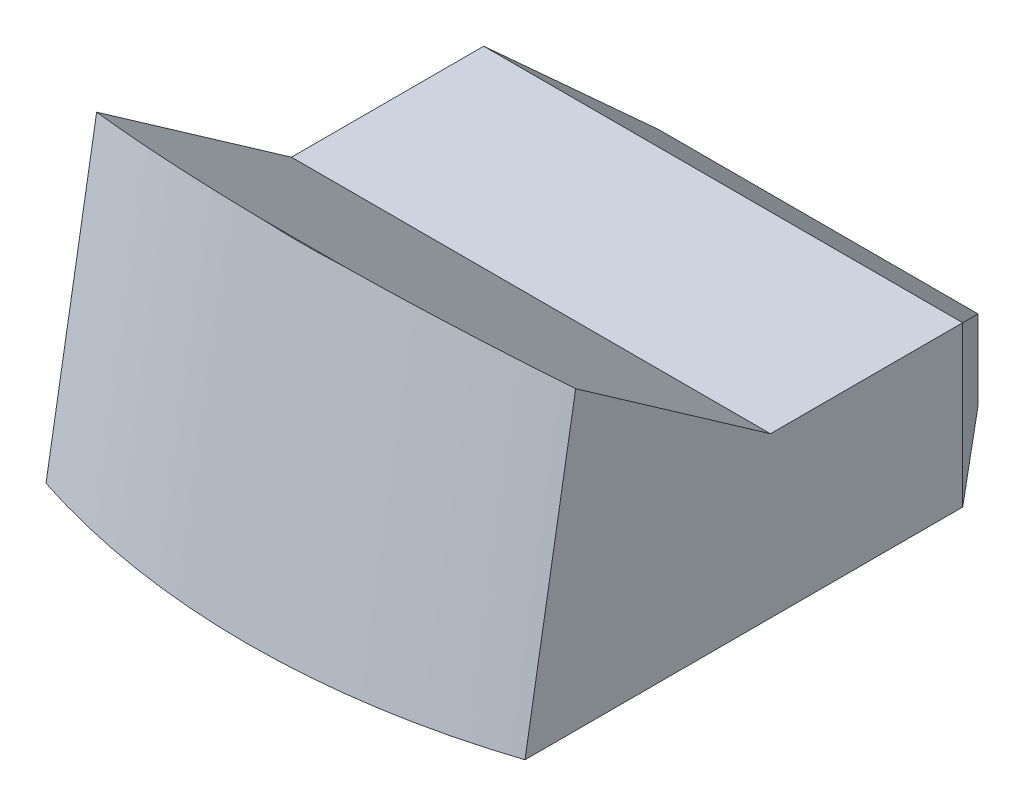
ISO-10303-21;
HEADER;
FILE_DESCRIPTION(('STEP AP214'),'2;1');
FILE_NAME('part.step','',(''),(''),'','','');
FILE_SCHEMA(('AUTOMOTIVE_DESIGN { 1 0 10303 214 1 1 1 1 }'));
ENDSEC;
DATA;
#1=APPLICATION_CONTEXT('core data for automotive mechanical design processes');
#2=APPLICATION_PROTOCOL_DEFINITION('international standard','automotive_design',2000,#1);
#3=PRODUCT_CONTEXT('',#1,'mechanical');
#4=PRODUCT('Part','Part','',(#3));
#5=PRODUCT_RELATED_PRODUCT_CATEGORY('part','',(#4));
#6=PRODUCT_DEFINITION_FORMATION('','',#4);
#7=PRODUCT_DEFINITION_CONTEXT('part definition',#1,'design');
#8=PRODUCT_DEFINITION('design','',#6,#7);
#9=PRODUCT_DEFINITION_SHAPE('','',#8);
#10=(LENGTH_UNIT() NAMED_UNIT(*) SI_UNIT(.MILLI.,.METRE.));
#11=(NAMED_UNIT(*) PLANE_ANGLE_UNIT() SI_UNIT($,.RADIAN.));
#12=(NAMED_UNIT(*) SI_UNIT($,.STERADIAN.) SOLID_ANGLE_UNIT());
#13=UNCERTAINTY_MEASURE_WITH_UNIT(LENGTH_MEASURE(1.E-05),#10,'distance_accuracy_value','');
#14=(GEOMETRIC_REPRESENTATION_CONTEXT(3) GLOBAL_UNCERTAINTY_ASSIGNED_CONTEXT((#13)) GLOBAL_UNIT_ASSIGNED_CONTEXT((#10,
#11,#12)) REPRESENTATION_CONTEXT('',''));
#15=CARTESIAN_POINT('',(0.,0.,0.));
#16=DIRECTION('',(0.,0.,1.));
#17=DIRECTION('',(1.,0.,0.));
#18=AXIS2_PLACEMENT_3D('',#15,#16,#17);
#19=CARTESIAN_POINT('',(0.,0.,0.));
#20=DIRECTION('',(0.,1.,0.));
#21=DIRECTION('',(0.,0.,1.));
#22=AXIS2_PLACEMENT_3D('',#19,#20,#21);
#23=PLANE('',#22);
#24=DIRECTION('',(0.,0.,-1.));
#25=VECTOR('',#24,1.);
#26=CARTESIAN_POINT('',(1.5,0.,-1.));
#27=LINE('',#26,#25);
#28=CARTESIAN_POINT('',(1.5,0.,2.33739441315654));
#29=VERTEX_POINT('',#28);
#30=CARTESIAN_POINT('',(1.5,0.,-0.404123203702895));
#31=VERTEX_POINT('',#30);
#32=EDGE_CURVE('E126',#29,#31,#27,.T.);
#33=ORIENTED_EDGE('',*,*,#32,.F.);
#34=CARTESIAN_POINT('',(-7.08002108279338E-06,0.,-2.23357263115002));
#35=DIRECTION('',(0.,-1.,0.));
#36=DIRECTION('',(0.,0.,-1.));
#37=AXIS2_PLACEMENT_3D('',#34,#35,#36);
#38=CIRCLE('',#37,4.81079629170161);
#39=CARTESIAN_POINT('',(-1.5,0.,2.33739905988714));
#40=VERTEX_POINT('',#39);
#41=EDGE_CURVE('E113',#29,#40,#38,.T.);
#42=ORIENTED_EDGE('',*,*,#41,.T.);
#43=DIRECTION('',(0.,0.,1.));
#44=VECTOR('',#43,1.);
#45=CARTESIAN_POINT('',(-1.5,0.,-1.));
#46=LINE('',#45,#44);
#47=CARTESIAN_POINT('',(-1.5,0.,-0.404123203702895));
#48=VERTEX_POINT('',#47);
#49=EDGE_CURVE('E138',#48,#40,#46,.T.);
#50=ORIENTED_EDGE('',*,*,#49,.F.);
#51=DIRECTION('',(-0.642787609686541,0.,0.766044443118977));
#52=VECTOR('',#51,1.);
#53=CARTESIAN_POINT('',(-1.5,0.,-0.404123203702895));
#54=LINE('',#53,#52);
#55=CARTESIAN_POINT('',(-0.999999999999998,0.,-1.));
#56=VERTEX_POINT('',#55);
#57=EDGE_CURVE('E154',#48,#56,#54,.F.);
#58=ORIENTED_EDGE('',*,*,#57,.T.);
#59=DIRECTION('',(-1.,0.,0.));
#60=VECTOR('',#59,1.);
#61=CARTESIAN_POINT('',(-1.5,0.,-1.));
#62=LINE('',#61,#60);
#63=CARTESIAN_POINT('',(0.999999999999998,0.,-1.));
#64=VERTEX_POINT('',#63);
#65=EDGE_CURVE('E140',#64,#56,#62,.T.);
#66=ORIENTED_EDGE('',*,*,#65,.F.);
#67=DIRECTION('',(-0.642787609686541,0.,-0.766044443118977));
#68=VECTOR('',#67,1.);
#69=CARTESIAN_POINT('',(0.999999999999998,0.,-1.));
#70=LINE('',#69,#68);
#71=EDGE_CURVE('E134',#64,#31,#70,.F.);
#72=ORIENTED_EDGE('',*,*,#71,.T.);
#73=EDGE_LOOP('',(#33,#42,#50,#58,#66,#72));
#74=FACE_BOUND('',#73,.T.);
#75=ADVANCED_FACE('F41',(#74),#23,.F.);
#76=CARTESIAN_POINT('',(-1.5,1.,-1.));
#77=DIRECTION('',(1.,0.,0.));
#78=DIRECTION('',(0.,0.,-1.));
#79=AXIS2_PLACEMENT_3D('',#76,#77,#78);
#80=PLANE('',#79);
#81=DIRECTION('',(0.,-0.985683546391294,0.168605890684407));
#82=VECTOR('',#81,1.);
#83=CARTESIAN_POINT('',(-1.5,3.3513240577304,1.76413903156015));
#84=LINE('',#83,#82);
#85=CARTESIAN_POINT('',(-1.5,1.85439087225864,2.02019662119483));
#86=VERTEX_POINT('',#85);
#87=EDGE_CURVE('E117',#86,#40,#84,.T.);
#88=ORIENTED_EDGE('',*,*,#87,.F.);
#89=DIRECTION('',(0.,0.573576436351047,0.819152044288991));
#90=VECTOR('',#89,1.);
#91=CARTESIAN_POINT('',(-1.5,2.,2.22814800674211));
#92=LINE('',#91,#90);
#93=CARTESIAN_POINT('',(-1.5,1.,0.8));
#94=VERTEX_POINT('',#93);
#95=EDGE_CURVE('E171',#86,#94,#92,.F.);
#96=ORIENTED_EDGE('',*,*,#95,.T.);
#97=DIRECTION('',(0.,0.,1.));
#98=VECTOR('',#97,1.);
#99=CARTESIAN_POINT('',(-1.5,1.,-1.));
#100=LINE('',#99,#98);
#101=CARTESIAN_POINT('',(-1.5,1.,-0.404123203702895));
#102=VERTEX_POINT('',#101);
#103=EDGE_CURVE('E142',#102,#94,#100,.T.);
#104=ORIENTED_EDGE('',*,*,#103,.F.);
#105=DIRECTION('',(0.,-1.,0.));
#106=VECTOR('',#105,1.);
#107=CARTESIAN_POINT('',(-1.5,1.,-0.404123203702895));
#108=LINE('',#107,#106);
#109=EDGE_CURVE('E163',#102,#48,#108,.T.);
#110=ORIENTED_EDGE('',*,*,#109,.T.);
#111=ORIENTED_EDGE('',*,*,#49,.T.);
#112=EDGE_LOOP('',(#88,#96,#104,#110,#111));
#113=FACE_BOUND('',#112,.T.);
#114=ADVANCED_FACE('F215',(#113),#80,.F.);
#115=CARTESIAN_POINT('',(1.5,1.,-1.));
#116=DIRECTION('',(-1.,0.,0.));
#117=DIRECTION('',(0.,0.,1.));
#118=AXIS2_PLACEMENT_3D('',#115,#116,#117);
#119=PLANE('',#118);
#120=DIRECTION('',(0.,-0.985683546391294,0.168605890684407));
#121=VECTOR('',#120,1.);
#122=CARTESIAN_POINT('',(1.5,3.3513240577304,1.76413438482955));
#123=LINE('',#122,#121);
#124=CARTESIAN_POINT('',(1.49999999999999,1.85438796660428,2.02019247149033));
#125=VERTEX_POINT('',#124);
#126=EDGE_CURVE('E116',#29,#125,#123,.F.);
#127=ORIENTED_EDGE('',*,*,#126,.F.);
#128=ORIENTED_EDGE('',*,*,#32,.T.);
#129=DIRECTION('',(0.,1.,0.));
#130=VECTOR('',#129,1.);
#131=CARTESIAN_POINT('',(1.5,1.,-0.404123203702895));
#132=LINE('',#131,#130);
#133=CARTESIAN_POINT('',(1.5,1.,-0.404123203702895));
#134=VERTEX_POINT('',#133);
#135=EDGE_CURVE('E158',#31,#134,#132,.T.);
#136=ORIENTED_EDGE('',*,*,#135,.T.);
#137=DIRECTION('',(0.,0.,-1.));
#138=VECTOR('',#137,1.);
#139=CARTESIAN_POINT('',(1.5,1.,-1.));
#140=LINE('',#139,#138);
#141=CARTESIAN_POINT('',(1.5,1.,0.799999999999999));
#142=VERTEX_POINT('',#141);
#143=EDGE_CURVE('E147',#142,#134,#140,.T.);
#144=ORIENTED_EDGE('',*,*,#143,.F.);
#145=DIRECTION('',(0.,-0.573576436351047,-0.819152044288991));
#146=VECTOR('',#145,1.);
#147=CARTESIAN_POINT('',(1.5,2.,2.22814800674211));
#148=LINE('',#147,#146);
#149=EDGE_CURVE('E131',#142,#125,#148,.F.);
#150=ORIENTED_EDGE('',*,*,#149,.T.);
#151=EDGE_LOOP('',(#127,#128,#136,#144,#150));
#152=FACE_BOUND('',#151,.T.);
#153=ADVANCED_FACE('F129',(#152),#119,.F.);
#154=CARTESIAN_POINT('',(0.,2.,0.));
#155=DIRECTION('',(0.,-1.,0.));
#156=DIRECTION('',(0.,0.,-1.));
#157=AXIS2_PLACEMENT_3D('',#154,#155,#156);
#158=PLANE('',#157);
#159=CARTESIAN_POINT('',(0.258790571116206,2.,2.22814800674211));
#160=CARTESIAN_POINT('',(0.172524687403812,2.,2.23279205777459));
#161=CARTESIAN_POINT('',(0.0862588036914184,2.,2.23511408329083));
#162=CARTESIAN_POINT('',(-0.0862729637333691,2.,2.23511408329083));
#163=CARTESIAN_POINT('',(-0.172538847445763,2.,2.23279205777459));
#164=CARTESIAN_POINT('',(-0.258804731158157,2.,2.22814800674211));
#165=B_SPLINE_CURVE_WITH_KNOTS('',3,(#159,#160,#161,#162,#163,#164),.UNSPECIFIED.,.F.,.F.,(4,2,
4),(0.,0.258891387374329,0.517782774748658),.UNSPECIFIED.);
#166=CARTESIAN_POINT('',(0.258790571116206,2.,2.22814800674211));
#167=VERTEX_POINT('',#166);
#168=CARTESIAN_POINT('',(-0.258804731147349,2.,2.22814800674211));
#169=VERTEX_POINT('',#168);
#170=EDGE_CURVE('E65',#167,#169,#165,.T.);
#171=ORIENTED_EDGE('',*,*,#170,.F.);
#172=DIRECTION('',(-1.,0.,0.));
#173=VECTOR('',#172,1.);
#174=CARTESIAN_POINT('',(0.,2.,2.22814800674211));
#175=LINE('',#174,#173);
#176=EDGE_CURVE('E161',#167,#169,#175,.T.);
#177=ORIENTED_EDGE('',*,*,#176,.T.);
#178=EDGE_LOOP('',(#171,#177));
#179=FACE_BOUND('',#178,.T.);
#180=ADVANCED_FACE('F185',(#179),#158,.F.);
#181=CARTESIAN_POINT('',(0.,2.,2.22814800674211));
#182=DIRECTION('',(0.,-0.819152044288991,0.573576436351047));
#183=DIRECTION('',(-1.,0.,0.));
#184=AXIS2_PLACEMENT_3D('',#181,#182,#183);
#185=PLANE('',#184);
#186=ORIENTED_EDGE('',*,*,#176,.F.);
#187=CARTESIAN_POINT('',(0.258790571116206,2.,2.22814800674211));
#188=CARTESIAN_POINT('',(0.311902302339235,1.99821117231693,2.22559329605214));
#189=CARTESIAN_POINT('',(0.36495741919501,1.99587113359007,2.22225137440867));
#190=CARTESIAN_POINT('',(0.470684143693704,1.99010577029308,2.21401758230793));
#191=CARTESIAN_POINT('',(0.523356442351001,1.98668461475453,2.20913166584479));
#192=CARTESIAN_POINT('',(0.62832029300865,1.97877042057171,2.19782902519763));
#193=CARTESIAN_POINT('',(0.680612470649638,1.9742801109483,2.1914161984593));
#194=CARTESIAN_POINT('',(0.784818371447147,1.96423792034525,2.17707446396623));
#195=CARTESIAN_POINT('',(0.836732487895667,1.95868738171989,2.16914747329208));
#196=CARTESIAN_POINT('',(0.940182194718696,1.94653154920992,2.15178714532268));
#197=CARTESIAN_POINT('',(0.991717797123437,1.93992628900037,2.14235385612039));
#198=CARTESIAN_POINT('',(1.094414697245,1.92566388104964,2.12198502663421));
#199=CARTESIAN_POINT('',(1.14557542891936,1.91800539261314,2.11104757163896));
#200=CARTESIAN_POINT('',(1.24752240509138,1.90163609476635,2.08766979154731));
#201=CARTESIAN_POINT('',(1.29830737061286,1.89292266552944,2.07522572495072));
#202=CARTESIAN_POINT('',(1.39950167228478,1.87444011466187,2.0488299067697));
#203=CARTESIAN_POINT('',(1.44990886114913,1.86466712470727,2.03487263064612));
#204=CARTESIAN_POINT('',(1.49999999999999,1.85438796660426,2.02019247149032));
#205=B_SPLINE_CURVE_WITH_KNOTS('',3,(#187,#188,#189,#190,#191,#192,#193,#194,#195,#196,#197,
#198,#199,#200,#201,#202,#203,#204),.UNSPECIFIED.,.F.,.F.,(4,2,2,2,2,2,2,2,4),(0.,
0.159600681138289,0.318593265701615,0.477184291220712,0.635575840077288,0.793962332833114,
0.952552341000865,1.11154459518496,1.27113821077303),.UNSPECIFIED.);
#206=EDGE_CURVE('E11',#167,#125,#205,.T.);
#207=ORIENTED_EDGE('',*,*,#206,.T.);
#208=ORIENTED_EDGE('',*,*,#149,.F.);
#209=DIRECTION('',(-1.,0.,0.));
#210=VECTOR('',#209,1.);
#211=CARTESIAN_POINT('',(-1.5,1.,0.8));
#212=LINE('',#211,#210);
#213=EDGE_CURVE('E141',#142,#94,#212,.T.);
#214=ORIENTED_EDGE('',*,*,#213,.T.);
#215=ORIENTED_EDGE('',*,*,#95,.F.);
#216=CARTESIAN_POINT('',(-1.5,1.85439087225864,2.02019662119483));
#217=CARTESIAN_POINT('',(-1.44990939940043,1.86466981241531,2.03487646909101));
#218=CARTESIAN_POINT('',(-1.39950275911285,1.87444259565521,2.04883344999538));
#219=CARTESIAN_POINT('',(-1.29830956669444,1.89292475780474,2.07522871302952));
#220=CARTESIAN_POINT('',(-1.24752516173026,1.90163800486209,2.08767251944673));
#221=CARTESIAN_POINT('',(-1.14557931860477,1.91800696277656,2.11104981406472));
#222=CARTESIAN_POINT('',(-1.09441915934861,1.92566529334015,2.12198704359408));
#223=CARTESIAN_POINT('',(-0.991723415899048,1.93992740982079,2.14235545681784));
#224=CARTESIAN_POINT('',(-0.940188397716684,1.94653253637104,2.15178855513486));
#225=CARTESIAN_POINT('',(-0.83673987133643,1.95868812582328,2.16914853598185));
#226=CARTESIAN_POINT('',(-0.784826351109206,1.96423855505242,2.17707537042201));
#227=CARTESIAN_POINT('',(-0.680621654705324,1.97428055131118,2.19141682736267));
#228=CARTESIAN_POINT('',(-0.628330085257971,1.97877077604876,2.19782953287147));
#229=CARTESIAN_POINT('',(-0.523367463033386,1.98668482524688,2.20913196645902));
#230=CARTESIAN_POINT('',(-0.470695784648869,1.99010592081396,2.21401779727402));
#231=CARTESIAN_POINT('',(-0.364970312880816,1.99587118943447,2.22225145416273));
#232=CARTESIAN_POINT('',(-0.311915828518574,1.99821119365247,2.22559332652244));
#233=CARTESIAN_POINT('',(-0.258804731147349,2.00000000000036,2.22814800674263));
#234=B_SPLINE_CURVE_WITH_KNOTS('',3,(#216,#217,#218,#219,#220,#221,#222,#223,#224,#225,#226,
#227,#228,#229,#230,#231,#232,#233),.UNSPECIFIED.,.F.,.F.,(4,2,2,2,2,2,2,2,4),(0.,
0.159591711474085,0.318582082595133,0.477170221801605,0.635554852779742,0.793944539582119,
0.952533696084151,1.11152439756652,1.2711231742047),.UNSPECIFIED.);
#235=EDGE_CURVE('E57',#86,#169,#234,.T.);
#236=ORIENTED_EDGE('',*,*,#235,.T.);
#237=EDGE_LOOP('',(#186,#207,#208,#214,#215,#236));
#238=FACE_BOUND('',#237,.T.);
#239=ADVANCED_FACE('F42',(#238),#185,.F.);
#240=CARTESIAN_POINT('',(-1.5,1.,-1.));
#241=DIRECTION('',(0.,0.,1.));
#242=DIRECTION('',(1.,0.,0.));
#243=AXIS2_PLACEMENT_3D('',#240,#241,#242);
#244=PLANE('',#243);
#245=DIRECTION('',(1.,0.,0.));
#246=VECTOR('',#245,1.);
#247=CARTESIAN_POINT('',(1.5,0.499999999999998,-1.));
#248=LINE('',#247,#246);
#249=CARTESIAN_POINT('',(-0.999999999999998,0.499999999999998,-1.));
#250=VERTEX_POINT('',#249);
#251=CARTESIAN_POINT('',(0.999999999999998,0.499999999999998,-1.));
#252=VERTEX_POINT('',#251);
#253=EDGE_CURVE('E148',#250,#252,#248,.T.);
#254=ORIENTED_EDGE('',*,*,#253,.T.);
#255=DIRECTION('',(0.,-1.,0.));
#256=VECTOR('',#255,1.);
#257=CARTESIAN_POINT('',(0.999999999999998,1.,-1.));
#258=LINE('',#257,#256);
#259=EDGE_CURVE('E155',#252,#64,#258,.T.);
#260=ORIENTED_EDGE('',*,*,#259,.T.);
#261=ORIENTED_EDGE('',*,*,#65,.T.);
#262=DIRECTION('',(0.,1.,0.));
#263=VECTOR('',#262,1.);
#264=CARTESIAN_POINT('',(-0.999999999999998,1.,-1.));
#265=LINE('',#264,#263);
#266=EDGE_CURVE('E146',#56,#250,#265,.T.);
#267=ORIENTED_EDGE('',*,*,#266,.T.);
#268=EDGE_LOOP('',(#254,#260,#261,#267));
#269=FACE_BOUND('',#268,.T.);
#270=ADVANCED_FACE('F207',(#269),#244,.F.);
#271=CARTESIAN_POINT('',(0.,1.,0.));
#272=DIRECTION('',(0.,1.,0.));
#273=DIRECTION('',(0.,0.,1.));
#274=AXIS2_PLACEMENT_3D('',#271,#272,#273);
#275=PLANE('',#274);
#276=ORIENTED_EDGE('',*,*,#143,.T.);
#277=DIRECTION('',(-1.,0.,0.));
#278=VECTOR('',#277,1.);
#279=CARTESIAN_POINT('',(-1.5,1.,-0.404123203702895));
#280=LINE('',#279,#278);
#281=EDGE_CURVE('E72',#134,#102,#280,.T.);
#282=ORIENTED_EDGE('',*,*,#281,.T.);
#283=ORIENTED_EDGE('',*,*,#103,.T.);
#284=ORIENTED_EDGE('',*,*,#213,.F.);
#285=EDGE_LOOP('',(#276,#282,#283,#284));
#286=FACE_BOUND('',#285,.T.);
#287=ADVANCED_FACE('F200',(#286),#275,.T.);
#288=CARTESIAN_POINT('',(-1.5,1.,-0.404123203702895));
#289=DIRECTION('',(0.766044443118977,0.,0.642787609686541));
#290=DIRECTION('',(0.,-1.,0.));
#291=AXIS2_PLACEMENT_3D('',#288,#289,#290);
#292=PLANE('',#291);
#293=ORIENTED_EDGE('',*,*,#57,.F.);
#294=ORIENTED_EDGE('',*,*,#109,.F.);
#295=DIRECTION('',(-0.540716203060938,0.540716203060938,0.64440047757177));
#296=VECTOR('',#295,1.);
#297=CARTESIAN_POINT('',(-1.5,1.,-0.404123203702895));
#298=LINE('',#297,#296);
#299=EDGE_CURVE('E168',#250,#102,#298,.T.);
#300=ORIENTED_EDGE('',*,*,#299,.F.);
#301=ORIENTED_EDGE('',*,*,#266,.F.);
#302=EDGE_LOOP('',(#293,#294,#300,#301));
#303=FACE_BOUND('',#302,.T.);
#304=ADVANCED_FACE('F214',(#303),#292,.F.);
#305=CARTESIAN_POINT('',(0.,1.,-0.404123203702895));
#306=DIRECTION('',(0.,0.766044443118977,-0.642787609686541));
#307=DIRECTION('',(1.,0.,0.));
#308=AXIS2_PLACEMENT_3D('',#305,#306,#307);
#309=PLANE('',#308);
#310=ORIENTED_EDGE('',*,*,#299,.T.);
#311=ORIENTED_EDGE('',*,*,#281,.F.);
#312=DIRECTION('',(0.540716203060938,0.540716203060938,0.64440047757177));
#313=VECTOR('',#312,1.);
#314=CARTESIAN_POINT('',(1.06143898162104,0.561438981621044,-0.926779872927789));
#315=LINE('',#314,#313);
#316=EDGE_CURVE('E135',#252,#134,#315,.T.);
#317=ORIENTED_EDGE('',*,*,#316,.F.);
#318=ORIENTED_EDGE('',*,*,#253,.F.);
#319=EDGE_LOOP('',(#310,#311,#317,#318));
#320=FACE_BOUND('',#319,.T.);
#321=ADVANCED_FACE('F199',(#320),#309,.T.);
#322=CARTESIAN_POINT('',(0.999999999999998,1.,-1.));
#323=DIRECTION('',(-0.766044443118977,0.,0.642787609686541));
#324=DIRECTION('',(0.,-1.,0.));
#325=AXIS2_PLACEMENT_3D('',#322,#323,#324);
#326=PLANE('',#325);
#327=ORIENTED_EDGE('',*,*,#316,.T.);
#328=ORIENTED_EDGE('',*,*,#135,.F.);
#329=ORIENTED_EDGE('',*,*,#71,.F.);
#330=ORIENTED_EDGE('',*,*,#259,.F.);
#331=EDGE_LOOP('',(#327,#328,#329,#330));
#332=FACE_BOUND('',#331,.T.);
#333=ADVANCED_FACE('F181',(#332),#326,.F.);
#334=CARTESIAN_POINT('',(-7.08002108279338E-06,3.3513240577304,-2.806832659477));
#335=DIRECTION('',(0.,-1.,0.));
#336=DIRECTION('',(0.,0.,-1.));
#337=AXIS2_PLACEMENT_3D('',#334,#335,#336);
#338=CIRCLE('',#337,4.81079629170161);
#339=DIRECTION('',(0.,-0.985683546391294,0.168605890684407));
#340=VECTOR('',#339,1.);
#341=SURFACE_OF_LINEAR_EXTRUSION('',#338,#340);
#342=ORIENTED_EDGE('',*,*,#126,.T.);
#343=ORIENTED_EDGE('',*,*,#206,.F.);
#344=ORIENTED_EDGE('',*,*,#170,.T.);
#345=ORIENTED_EDGE('',*,*,#235,.F.);
#346=ORIENTED_EDGE('',*,*,#87,.T.);
#347=ORIENTED_EDGE('',*,*,#41,.F.);
#348=EDGE_LOOP('',(#342,#343,#344,#345,#346,#347));
#349=FACE_BOUND('',#348,.T.);
#350=ADVANCED_FACE('F114',(#349),#341,.T.);
#351=CLOSED_SHELL('',(#75,#114,#153,#180,#239,#270,#287,#304,#321,#333,#350));
#352=MANIFOLD_SOLID_BREP('B2',#351);
#353=ADVANCED_BREP_SHAPE_REPRESENTATION('',(#18,#352),#14);
#354=SHAPE_DEFINITION_REPRESENTATION(#9,#353);
ENDSEC;
END-ISO-10303-21;
